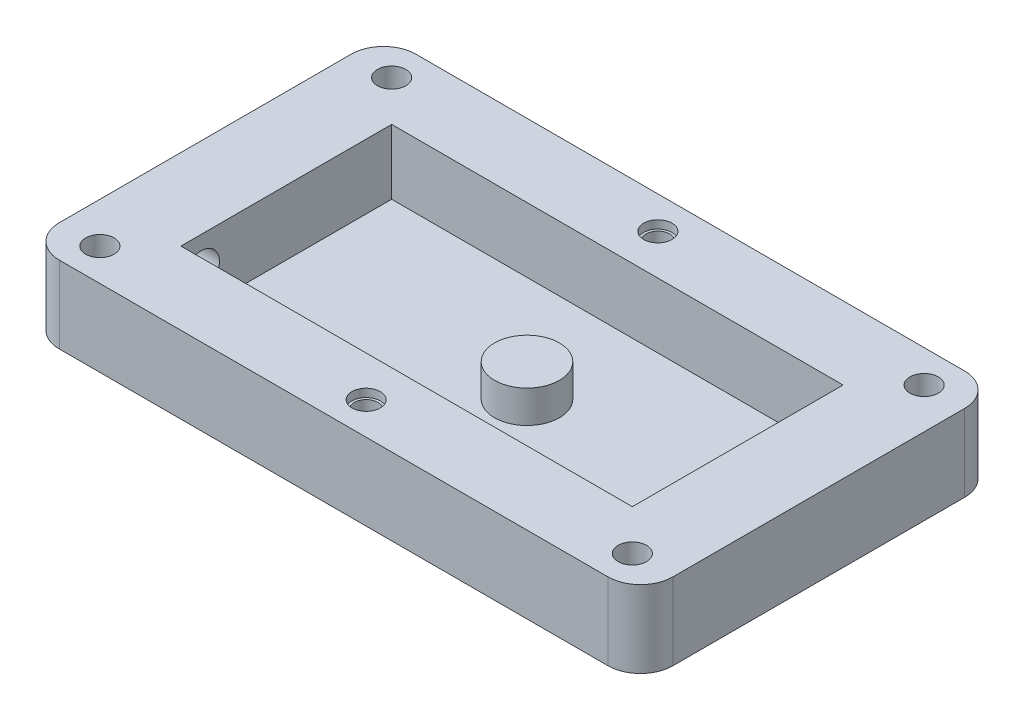
ISO-10303-21;
HEADER;
FILE_DESCRIPTION(('STEP AP214'),'2;1');
FILE_NAME('part.step','',(''),(''),'','','');
FILE_SCHEMA(('AUTOMOTIVE_DESIGN { 1 0 10303 214 1 1 1 1 }'));
ENDSEC;
DATA;
#1=APPLICATION_CONTEXT('core data for automotive mechanical design processes');
#2=APPLICATION_PROTOCOL_DEFINITION('international standard','automotive_design',2000,#1);
#3=PRODUCT_CONTEXT('',#1,'mechanical');
#4=PRODUCT('Part','Part','',(#3));
#5=PRODUCT_RELATED_PRODUCT_CATEGORY('part','',(#4));
#6=PRODUCT_DEFINITION_FORMATION('','',#4);
#7=PRODUCT_DEFINITION_CONTEXT('part definition',#1,'design');
#8=PRODUCT_DEFINITION('design','',#6,#7);
#9=PRODUCT_DEFINITION_SHAPE('','',#8);
#10=(LENGTH_UNIT() NAMED_UNIT(*) SI_UNIT(.MILLI.,.METRE.));
#11=(NAMED_UNIT(*) PLANE_ANGLE_UNIT() SI_UNIT($,.RADIAN.));
#12=(NAMED_UNIT(*) SI_UNIT($,.STERADIAN.) SOLID_ANGLE_UNIT());
#13=UNCERTAINTY_MEASURE_WITH_UNIT(LENGTH_MEASURE(1.E-05),#10,'distance_accuracy_value','');
#14=(GEOMETRIC_REPRESENTATION_CONTEXT(3) GLOBAL_UNCERTAINTY_ASSIGNED_CONTEXT((#13)) GLOBAL_UNIT_ASSIGNED_CONTEXT((#10,
#11,#12)) REPRESENTATION_CONTEXT('',''));
#15=CARTESIAN_POINT('',(0.,0.,0.));
#16=DIRECTION('',(0.,0.,1.));
#17=DIRECTION('',(1.,0.,0.));
#18=AXIS2_PLACEMENT_3D('',#15,#16,#17);
#19=CARTESIAN_POINT('',(0.,1.5,-22.));
#20=DIRECTION('',(0.,0.,-1.));
#21=DIRECTION('',(-1.,0.,0.));
#22=AXIS2_PLACEMENT_3D('',#19,#20,#21);
#23=PLANE('',#22);
#24=DIRECTION('',(1.,0.,0.));
#25=VECTOR('',#24,1.);
#26=CARTESIAN_POINT('',(0.,0.,-22.));
#27=LINE('',#26,#25);
#28=CARTESIAN_POINT('',(-39.25,0.,-22.));
#29=VERTEX_POINT('',#28);
#30=CARTESIAN_POINT('',(28.45,0.,-22.));
#31=VERTEX_POINT('',#30);
#32=EDGE_CURVE('E171',#29,#31,#27,.T.);
#33=ORIENTED_EDGE('',*,*,#32,.F.);
#34=DIRECTION('',(0.,-1.,0.));
#35=VECTOR('',#34,1.);
#36=CARTESIAN_POINT('',(-39.25,1.5,-22.));
#37=LINE('',#36,#35);
#38=CARTESIAN_POINT('',(-39.25,9.5,-22.));
#39=VERTEX_POINT('',#38);
#40=EDGE_CURVE('E44',#39,#29,#37,.T.);
#41=ORIENTED_EDGE('',*,*,#40,.F.);
#42=DIRECTION('',(1.,0.,0.));
#43=VECTOR('',#42,1.);
#44=CARTESIAN_POINT('',(0.,9.5,-22.));
#45=LINE('',#44,#43);
#46=CARTESIAN_POINT('',(28.45,9.5,-22.));
#47=VERTEX_POINT('',#46);
#48=EDGE_CURVE('E248',#39,#47,#45,.T.);
#49=ORIENTED_EDGE('',*,*,#48,.T.);
#50=DIRECTION('',(0.,-1.,0.));
#51=VECTOR('',#50,1.);
#52=CARTESIAN_POINT('',(28.45,1.5,-22.));
#53=LINE('',#52,#51);
#54=EDGE_CURVE('E195',#47,#31,#53,.T.);
#55=ORIENTED_EDGE('',*,*,#54,.T.);
#56=EDGE_LOOP('',(#33,#41,#49,#55));
#57=FACE_BOUND('',#56,.T.);
#58=ADVANCED_FACE('F35',(#57),#23,.T.);
#59=CARTESIAN_POINT('',(-39.25,1.5,-18.));
#60=DIRECTION('',(0.,-1.,0.));
#61=DIRECTION('',(0.,0.,-1.));
#62=AXIS2_PLACEMENT_3D('',#59,#60,#61);
#63=CYLINDRICAL_SURFACE('',#62,4.);
#64=CARTESIAN_POINT('',(-39.25,0.,-18.));
#65=DIRECTION('',(0.,1.,0.));
#66=DIRECTION('',(0.,0.,1.));
#67=AXIS2_PLACEMENT_3D('',#64,#65,#66);
#68=CIRCLE('',#67,4.);
#69=CARTESIAN_POINT('',(-43.25,0.,-18.));
#70=VERTEX_POINT('',#69);
#71=EDGE_CURVE('E174',#29,#70,#68,.T.);
#72=ORIENTED_EDGE('',*,*,#71,.T.);
#73=DIRECTION('',(0.,-1.,0.));
#74=VECTOR('',#73,1.);
#75=CARTESIAN_POINT('',(-43.25,1.5,-18.));
#76=LINE('',#75,#74);
#77=CARTESIAN_POINT('',(-43.25,9.5,-18.));
#78=VERTEX_POINT('',#77);
#79=EDGE_CURVE('E210',#78,#70,#76,.T.);
#80=ORIENTED_EDGE('',*,*,#79,.F.);
#81=CARTESIAN_POINT('',(-39.25,9.5,-18.));
#82=DIRECTION('',(0.,1.,0.));
#83=DIRECTION('',(0.,0.,1.));
#84=AXIS2_PLACEMENT_3D('',#81,#82,#83);
#85=CIRCLE('',#84,4.);
#86=EDGE_CURVE('E251',#39,#78,#85,.T.);
#87=ORIENTED_EDGE('',*,*,#86,.F.);
#88=ORIENTED_EDGE('',*,*,#40,.T.);
#89=EDGE_LOOP('',(#72,#80,#87,#88));
#90=FACE_BOUND('',#89,.T.);
#91=ADVANCED_FACE('F288',(#90),#63,.T.);
#92=CARTESIAN_POINT('',(-43.25,1.5,0.));
#93=DIRECTION('',(1.,0.,0.));
#94=DIRECTION('',(0.,0.,-1.));
#95=AXIS2_PLACEMENT_3D('',#92,#93,#94);
#96=PLANE('',#95);
#97=CARTESIAN_POINT('',(-43.25,5.5,10.5));
#98=DIRECTION('',(-1.,0.,0.));
#99=DIRECTION('',(0.,0.,1.));
#100=AXIS2_PLACEMENT_3D('',#97,#98,#99);
#101=CIRCLE('',#100,2.25);
#102=CARTESIAN_POINT('',(-43.25,5.5,12.75));
#103=VERTEX_POINT('',#102);
#104=EDGE_CURVE('E217',#103,#103,#101,.T.);
#105=ORIENTED_EDGE('',*,*,#104,.F.);
#106=EDGE_LOOP('',(#105));
#107=FACE_BOUND('',#106,.T.);
#108=DIRECTION('',(0.,0.,1.));
#109=VECTOR('',#108,1.);
#110=CARTESIAN_POINT('',(-43.25,0.,0.));
#111=LINE('',#110,#109);
#112=CARTESIAN_POINT('',(-43.25,0.,18.));
#113=VERTEX_POINT('',#112);
#114=EDGE_CURVE('E177',#70,#113,#111,.T.);
#115=ORIENTED_EDGE('',*,*,#114,.T.);
#116=DIRECTION('',(0.,-1.,0.));
#117=VECTOR('',#116,1.);
#118=CARTESIAN_POINT('',(-43.25,1.5,18.));
#119=LINE('',#118,#117);
#120=CARTESIAN_POINT('',(-43.25,9.5,18.));
#121=VERTEX_POINT('',#120);
#122=EDGE_CURVE('E207',#121,#113,#119,.T.);
#123=ORIENTED_EDGE('',*,*,#122,.F.);
#124=DIRECTION('',(0.,0.,1.));
#125=VECTOR('',#124,1.);
#126=CARTESIAN_POINT('',(-43.25,9.5,0.));
#127=LINE('',#126,#125);
#128=EDGE_CURVE('E254',#78,#121,#127,.T.);
#129=ORIENTED_EDGE('',*,*,#128,.F.);
#130=ORIENTED_EDGE('',*,*,#79,.T.);
#131=EDGE_LOOP('',(#115,#123,#129,#130));
#132=FACE_BOUND('',#131,.T.);
#133=ADVANCED_FACE('F294',(#107,#132),#96,.F.);
#134=CARTESIAN_POINT('',(-39.25,1.5,18.));
#135=DIRECTION('',(0.,-1.,0.));
#136=DIRECTION('',(0.,0.,-1.));
#137=AXIS2_PLACEMENT_3D('',#134,#135,#136);
#138=CYLINDRICAL_SURFACE('',#137,4.);
#139=CARTESIAN_POINT('',(-39.25,0.,18.));
#140=DIRECTION('',(0.,1.,0.));
#141=DIRECTION('',(0.,0.,1.));
#142=AXIS2_PLACEMENT_3D('',#139,#140,#141);
#143=CIRCLE('',#142,4.);
#144=CARTESIAN_POINT('',(-39.25,0.,22.));
#145=VERTEX_POINT('',#144);
#146=EDGE_CURVE('E180',#113,#145,#143,.T.);
#147=ORIENTED_EDGE('',*,*,#146,.T.);
#148=DIRECTION('',(0.,-1.,0.));
#149=VECTOR('',#148,1.);
#150=CARTESIAN_POINT('',(-39.25,1.5,22.));
#151=LINE('',#150,#149);
#152=CARTESIAN_POINT('',(-39.25,9.5,22.));
#153=VERTEX_POINT('',#152);
#154=EDGE_CURVE('E204',#153,#145,#151,.T.);
#155=ORIENTED_EDGE('',*,*,#154,.F.);
#156=CARTESIAN_POINT('',(-39.25,9.5,18.));
#157=DIRECTION('',(0.,1.,0.));
#158=DIRECTION('',(0.,0.,1.));
#159=AXIS2_PLACEMENT_3D('',#156,#157,#158);
#160=CIRCLE('',#159,4.);
#161=EDGE_CURVE('E257',#121,#153,#160,.T.);
#162=ORIENTED_EDGE('',*,*,#161,.F.);
#163=ORIENTED_EDGE('',*,*,#122,.T.);
#164=EDGE_LOOP('',(#147,#155,#162,#163));
#165=FACE_BOUND('',#164,.T.);
#166=ADVANCED_FACE('F405',(#165),#138,.T.);
#167=CARTESIAN_POINT('',(0.,1.5,22.));
#168=DIRECTION('',(0.,0.,-1.));
#169=DIRECTION('',(-1.,0.,0.));
#170=AXIS2_PLACEMENT_3D('',#167,#168,#169);
#171=PLANE('',#170);
#172=DIRECTION('',(1.,0.,0.));
#173=VECTOR('',#172,1.);
#174=CARTESIAN_POINT('',(0.,0.,22.));
#175=LINE('',#174,#173);
#176=CARTESIAN_POINT('',(28.45,0.,22.));
#177=VERTEX_POINT('',#176);
#178=EDGE_CURVE('E183',#145,#177,#175,.T.);
#179=ORIENTED_EDGE('',*,*,#178,.T.);
#180=DIRECTION('',(0.,-1.,0.));
#181=VECTOR('',#180,1.);
#182=CARTESIAN_POINT('',(28.45,1.5,22.));
#183=LINE('',#182,#181);
#184=CARTESIAN_POINT('',(28.45,9.5,22.));
#185=VERTEX_POINT('',#184);
#186=EDGE_CURVE('E201',#185,#177,#183,.T.);
#187=ORIENTED_EDGE('',*,*,#186,.F.);
#188=DIRECTION('',(1.,0.,0.));
#189=VECTOR('',#188,1.);
#190=CARTESIAN_POINT('',(0.,9.5,22.));
#191=LINE('',#190,#189);
#192=EDGE_CURVE('E260',#153,#185,#191,.T.);
#193=ORIENTED_EDGE('',*,*,#192,.F.);
#194=ORIENTED_EDGE('',*,*,#154,.T.);
#195=EDGE_LOOP('',(#179,#187,#193,#194));
#196=FACE_BOUND('',#195,.T.);
#197=ADVANCED_FACE('F407',(#196),#171,.F.);
#198=CARTESIAN_POINT('',(28.45,1.5,18.));
#199=DIRECTION('',(0.,-1.,0.));
#200=DIRECTION('',(0.,0.,-1.));
#201=AXIS2_PLACEMENT_3D('',#198,#199,#200);
#202=CYLINDRICAL_SURFACE('',#201,4.);
#203=CARTESIAN_POINT('',(28.45,0.,18.));
#204=DIRECTION('',(0.,1.,0.));
#205=DIRECTION('',(0.,0.,1.));
#206=AXIS2_PLACEMENT_3D('',#203,#204,#205);
#207=CIRCLE('',#206,4.);
#208=CARTESIAN_POINT('',(32.45,0.,17.9999999999999));
#209=VERTEX_POINT('',#208);
#210=EDGE_CURVE('E186',#177,#209,#207,.T.);
#211=ORIENTED_EDGE('',*,*,#210,.T.);
#212=DIRECTION('',(0.,-1.,0.));
#213=VECTOR('',#212,1.);
#214=CARTESIAN_POINT('',(32.45,1.5,17.9999999999999));
#215=LINE('',#214,#213);
#216=CARTESIAN_POINT('',(32.45,9.5,17.9999999999999));
#217=VERTEX_POINT('',#216);
#218=EDGE_CURVE('E199',#217,#209,#215,.T.);
#219=ORIENTED_EDGE('',*,*,#218,.F.);
#220=CARTESIAN_POINT('',(28.45,9.5,18.));
#221=DIRECTION('',(0.,1.,0.));
#222=DIRECTION('',(0.,0.,1.));
#223=AXIS2_PLACEMENT_3D('',#220,#221,#222);
#224=CIRCLE('',#223,4.);
#225=EDGE_CURVE('E263',#185,#217,#224,.T.);
#226=ORIENTED_EDGE('',*,*,#225,.F.);
#227=ORIENTED_EDGE('',*,*,#186,.T.);
#228=EDGE_LOOP('',(#211,#219,#226,#227));
#229=FACE_BOUND('',#228,.T.);
#230=ADVANCED_FACE('F410',(#229),#202,.T.);
#231=CARTESIAN_POINT('',(32.45,1.5,0.));
#232=DIRECTION('',(1.,0.,0.));
#233=DIRECTION('',(0.,0.,-1.));
#234=AXIS2_PLACEMENT_3D('',#231,#232,#233);
#235=PLANE('',#234);
#236=DIRECTION('',(0.,0.,1.));
#237=VECTOR('',#236,1.);
#238=CARTESIAN_POINT('',(32.45,0.,0.));
#239=LINE('',#238,#237);
#240=CARTESIAN_POINT('',(32.45,0.,-18.));
#241=VERTEX_POINT('',#240);
#242=EDGE_CURVE('E189',#241,#209,#239,.T.);
#243=ORIENTED_EDGE('',*,*,#242,.F.);
#244=DIRECTION('',(0.,-1.,0.));
#245=VECTOR('',#244,1.);
#246=CARTESIAN_POINT('',(32.45,1.5,-18.));
#247=LINE('',#246,#245);
#248=CARTESIAN_POINT('',(32.45,9.5,-18.));
#249=VERTEX_POINT('',#248);
#250=EDGE_CURVE('E197',#249,#241,#247,.T.);
#251=ORIENTED_EDGE('',*,*,#250,.F.);
#252=DIRECTION('',(0.,0.,1.));
#253=VECTOR('',#252,1.);
#254=CARTESIAN_POINT('',(32.45,9.5,0.));
#255=LINE('',#254,#253);
#256=EDGE_CURVE('E266',#249,#217,#255,.T.);
#257=ORIENTED_EDGE('',*,*,#256,.T.);
#258=ORIENTED_EDGE('',*,*,#218,.T.);
#259=EDGE_LOOP('',(#243,#251,#257,#258));
#260=FACE_BOUND('',#259,.T.);
#261=ADVANCED_FACE('F304',(#260),#235,.T.);
#262=CARTESIAN_POINT('',(-5.4,1.5,18.));
#263=DIRECTION('',(0.,-1.,0.));
#264=DIRECTION('',(0.,0.,-1.));
#265=AXIS2_PLACEMENT_3D('',#262,#263,#264);
#266=CYLINDRICAL_SURFACE('',#265,1.75000000000001);
#267=CARTESIAN_POINT('',(-5.4,8.5,18.));
#268=DIRECTION('',(0.,1.,0.));
#269=DIRECTION('',(0.,0.,1.));
#270=AXIS2_PLACEMENT_3D('',#267,#268,#269);
#271=CIRCLE('',#270,1.75000000000001);
#272=CARTESIAN_POINT('',(-5.4,8.5,19.75));
#273=VERTEX_POINT('',#272);
#274=EDGE_CURVE('E39',#273,#273,#271,.F.);
#275=ORIENTED_EDGE('',*,*,#274,.T.);
#276=EDGE_LOOP('',(#275));
#277=FACE_BOUND('',#276,.T.);
#278=CARTESIAN_POINT('',(-5.4,9.5,18.));
#279=DIRECTION('',(0.,1.,0.));
#280=DIRECTION('',(0.,0.,1.));
#281=AXIS2_PLACEMENT_3D('',#278,#279,#280);
#282=CIRCLE('',#281,1.75000000000001);
#283=CARTESIAN_POINT('',(-5.4,9.5,19.75));
#284=VERTEX_POINT('',#283);
#285=EDGE_CURVE('E245',#284,#284,#282,.F.);
#286=ORIENTED_EDGE('',*,*,#285,.F.);
#287=EDGE_LOOP('',(#286));
#288=FACE_BOUND('',#287,.T.);
#289=ADVANCED_FACE('F300',(#277,#288),#266,.F.);
#290=CARTESIAN_POINT('',(27.45,1.5,18.));
#291=DIRECTION('',(0.,-1.,0.));
#292=DIRECTION('',(0.,0.,-1.));
#293=AXIS2_PLACEMENT_3D('',#290,#291,#292);
#294=CYLINDRICAL_SURFACE('',#293,1.75);
#295=CARTESIAN_POINT('',(27.45,0.,18.));
#296=DIRECTION('',(0.,1.,0.));
#297=DIRECTION('',(0.,0.,1.));
#298=AXIS2_PLACEMENT_3D('',#295,#296,#297);
#299=CIRCLE('',#298,1.75);
#300=CARTESIAN_POINT('',(27.45,0.,19.75));
#301=VERTEX_POINT('',#300);
#302=EDGE_CURVE('E168',#301,#301,#299,.T.);
#303=ORIENTED_EDGE('',*,*,#302,.F.);
#304=EDGE_LOOP('',(#303));
#305=FACE_BOUND('',#304,.T.);
#306=CARTESIAN_POINT('',(27.45,9.5,18.));
#307=DIRECTION('',(0.,1.,0.));
#308=DIRECTION('',(0.,0.,1.));
#309=AXIS2_PLACEMENT_3D('',#306,#307,#308);
#310=CIRCLE('',#309,1.75);
#311=CARTESIAN_POINT('',(27.45,9.5,19.75));
#312=VERTEX_POINT('',#311);
#313=EDGE_CURVE('E242',#312,#312,#310,.T.);
#314=ORIENTED_EDGE('',*,*,#313,.T.);
#315=EDGE_LOOP('',(#314));
#316=FACE_BOUND('',#315,.T.);
#317=ADVANCED_FACE('F303',(#305,#316),#294,.F.);
#318=CARTESIAN_POINT('',(-5.4,1.5,-18.));
#319=DIRECTION('',(0.,-1.,0.));
#320=DIRECTION('',(0.,0.,-1.));
#321=AXIS2_PLACEMENT_3D('',#318,#319,#320);
#322=CYLINDRICAL_SURFACE('',#321,1.75);
#323=CARTESIAN_POINT('',(-5.4,8.5,-18.));
#324=DIRECTION('',(0.,1.,0.));
#325=DIRECTION('',(0.,0.,1.));
#326=AXIS2_PLACEMENT_3D('',#323,#324,#325);
#327=CIRCLE('',#326,1.75);
#328=CARTESIAN_POINT('',(-5.4,8.5,-16.25));
#329=VERTEX_POINT('',#328);
#330=EDGE_CURVE('E11',#329,#329,#327,.T.);
#331=ORIENTED_EDGE('',*,*,#330,.F.);
#332=EDGE_LOOP('',(#331));
#333=FACE_BOUND('',#332,.T.);
#334=CARTESIAN_POINT('',(-5.4,9.5,-18.));
#335=DIRECTION('',(0.,1.,0.));
#336=DIRECTION('',(0.,0.,1.));
#337=AXIS2_PLACEMENT_3D('',#334,#335,#336);
#338=CIRCLE('',#337,1.75);
#339=CARTESIAN_POINT('',(-5.4,9.5,-16.25));
#340=VERTEX_POINT('',#339);
#341=EDGE_CURVE('E144',#340,#340,#338,.T.);
#342=ORIENTED_EDGE('',*,*,#341,.T.);
#343=EDGE_LOOP('',(#342));
#344=FACE_BOUND('',#343,.T.);
#345=ADVANCED_FACE('F308',(#333,#344),#322,.F.);
#346=CARTESIAN_POINT('',(-38.25,1.5,-18.));
#347=DIRECTION('',(0.,-1.,0.));
#348=DIRECTION('',(0.,0.,-1.));
#349=AXIS2_PLACEMENT_3D('',#346,#347,#348);
#350=CYLINDRICAL_SURFACE('',#349,1.75);
#351=CARTESIAN_POINT('',(-38.25,0.,-18.));
#352=DIRECTION('',(0.,1.,0.));
#353=DIRECTION('',(0.,0.,1.));
#354=AXIS2_PLACEMENT_3D('',#351,#352,#353);
#355=CIRCLE('',#354,1.75);
#356=CARTESIAN_POINT('',(-38.25,0.,-16.25));
#357=VERTEX_POINT('',#356);
#358=EDGE_CURVE('E165',#357,#357,#355,.T.);
#359=ORIENTED_EDGE('',*,*,#358,.F.);
#360=EDGE_LOOP('',(#359));
#361=FACE_BOUND('',#360,.T.);
#362=CARTESIAN_POINT('',(-38.25,9.5,-18.));
#363=DIRECTION('',(0.,1.,0.));
#364=DIRECTION('',(0.,0.,1.));
#365=AXIS2_PLACEMENT_3D('',#362,#363,#364);
#366=CIRCLE('',#365,1.75);
#367=CARTESIAN_POINT('',(-38.25,9.5,-16.25));
#368=VERTEX_POINT('',#367);
#369=EDGE_CURVE('E235',#368,#368,#366,.T.);
#370=ORIENTED_EDGE('',*,*,#369,.T.);
#371=EDGE_LOOP('',(#370));
#372=FACE_BOUND('',#371,.T.);
#373=ADVANCED_FACE('F312',(#361,#372),#350,.F.);
#374=CARTESIAN_POINT('',(27.45,1.5,-18.));
#375=DIRECTION('',(0.,-1.,0.));
#376=DIRECTION('',(0.,0.,-1.));
#377=AXIS2_PLACEMENT_3D('',#374,#375,#376);
#378=CYLINDRICAL_SURFACE('',#377,1.75);
#379=CARTESIAN_POINT('',(27.45,0.,-18.));
#380=DIRECTION('',(0.,1.,0.));
#381=DIRECTION('',(0.,0.,1.));
#382=AXIS2_PLACEMENT_3D('',#379,#380,#381);
#383=CIRCLE('',#382,1.75);
#384=CARTESIAN_POINT('',(27.45,0.,-16.25));
#385=VERTEX_POINT('',#384);
#386=EDGE_CURVE('E162',#385,#385,#383,.F.);
#387=ORIENTED_EDGE('',*,*,#386,.T.);
#388=EDGE_LOOP('',(#387));
#389=FACE_BOUND('',#388,.T.);
#390=CARTESIAN_POINT('',(27.45,9.5,-18.));
#391=DIRECTION('',(0.,1.,0.));
#392=DIRECTION('',(0.,0.,1.));
#393=AXIS2_PLACEMENT_3D('',#390,#391,#392);
#394=CIRCLE('',#393,1.75);
#395=CARTESIAN_POINT('',(27.45,9.5,-16.25));
#396=VERTEX_POINT('',#395);
#397=EDGE_CURVE('E221',#396,#396,#394,.F.);
#398=ORIENTED_EDGE('',*,*,#397,.F.);
#399=EDGE_LOOP('',(#398));
#400=FACE_BOUND('',#399,.T.);
#401=ADVANCED_FACE('F315',(#389,#400),#378,.F.);
#402=CARTESIAN_POINT('',(-38.25,1.5,18.));
#403=DIRECTION('',(0.,-1.,0.));
#404=DIRECTION('',(0.,0.,-1.));
#405=AXIS2_PLACEMENT_3D('',#402,#403,#404);
#406=CYLINDRICAL_SURFACE('',#405,1.75);
#407=CARTESIAN_POINT('',(-38.25,0.,18.));
#408=DIRECTION('',(0.,1.,0.));
#409=DIRECTION('',(0.,0.,1.));
#410=AXIS2_PLACEMENT_3D('',#407,#408,#409);
#411=CIRCLE('',#410,1.75);
#412=CARTESIAN_POINT('',(-38.25,0.,19.75));
#413=VERTEX_POINT('',#412);
#414=EDGE_CURVE('E159',#413,#413,#411,.F.);
#415=ORIENTED_EDGE('',*,*,#414,.T.);
#416=EDGE_LOOP('',(#415));
#417=FACE_BOUND('',#416,.T.);
#418=CARTESIAN_POINT('',(-38.25,9.5,18.));
#419=DIRECTION('',(0.,1.,0.));
#420=DIRECTION('',(0.,0.,1.));
#421=AXIS2_PLACEMENT_3D('',#418,#419,#420);
#422=CIRCLE('',#421,1.75);
#423=CARTESIAN_POINT('',(-38.25,9.5,19.75));
#424=VERTEX_POINT('',#423);
#425=EDGE_CURVE('E216',#424,#424,#422,.F.);
#426=ORIENTED_EDGE('',*,*,#425,.F.);
#427=EDGE_LOOP('',(#426));
#428=FACE_BOUND('',#427,.T.);
#429=ADVANCED_FACE('F37',(#417,#428),#406,.F.);
#430=CARTESIAN_POINT('',(28.45,1.5,-18.));
#431=DIRECTION('',(0.,-1.,0.));
#432=DIRECTION('',(0.,0.,-1.));
#433=AXIS2_PLACEMENT_3D('',#430,#431,#432);
#434=CYLINDRICAL_SURFACE('',#433,4.);
#435=CARTESIAN_POINT('',(28.45,0.,-18.));
#436=DIRECTION('',(0.,1.,0.));
#437=DIRECTION('',(0.,0.,1.));
#438=AXIS2_PLACEMENT_3D('',#435,#436,#437);
#439=CIRCLE('',#438,4.);
#440=EDGE_CURVE('E192',#31,#241,#439,.F.);
#441=ORIENTED_EDGE('',*,*,#440,.F.);
#442=ORIENTED_EDGE('',*,*,#54,.F.);
#443=CARTESIAN_POINT('',(28.45,9.5,-18.));
#444=DIRECTION('',(0.,1.,0.));
#445=DIRECTION('',(0.,0.,1.));
#446=AXIS2_PLACEMENT_3D('',#443,#444,#445);
#447=CIRCLE('',#446,4.);
#448=EDGE_CURVE('E269',#47,#249,#447,.F.);
#449=ORIENTED_EDGE('',*,*,#448,.T.);
#450=ORIENTED_EDGE('',*,*,#250,.T.);
#451=EDGE_LOOP('',(#441,#442,#449,#450));
#452=FACE_BOUND('',#451,.T.);
#453=ADVANCED_FACE('F322',(#452),#434,.T.);
#454=CARTESIAN_POINT('',(0.,0.,0.));
#455=DIRECTION('',(0.,1.,0.));
#456=DIRECTION('',(0.,0.,1.));
#457=AXIS2_PLACEMENT_3D('',#454,#455,#456);
#458=PLANE('',#457);
#459=ORIENTED_EDGE('',*,*,#414,.F.);
#460=EDGE_LOOP('',(#459));
#461=FACE_BOUND('',#460,.T.);
#462=ORIENTED_EDGE('',*,*,#386,.F.);
#463=EDGE_LOOP('',(#462));
#464=FACE_BOUND('',#463,.T.);
#465=ORIENTED_EDGE('',*,*,#358,.T.);
#466=EDGE_LOOP('',(#465));
#467=FACE_BOUND('',#466,.T.);
#468=ORIENTED_EDGE('',*,*,#302,.T.);
#469=EDGE_LOOP('',(#468));
#470=FACE_BOUND('',#469,.T.);
#471=ORIENTED_EDGE('',*,*,#32,.T.);
#472=ORIENTED_EDGE('',*,*,#440,.T.);
#473=ORIENTED_EDGE('',*,*,#242,.T.);
#474=ORIENTED_EDGE('',*,*,#210,.F.);
#475=ORIENTED_EDGE('',*,*,#178,.F.);
#476=ORIENTED_EDGE('',*,*,#146,.F.);
#477=ORIENTED_EDGE('',*,*,#114,.F.);
#478=ORIENTED_EDGE('',*,*,#71,.F.);
#479=EDGE_LOOP('',(#471,#472,#473,#474,#475,#476,#477,#478));
#480=FACE_BOUND('',#479,.T.);
#481=CARTESIAN_POINT('',(-5.4,0.,-18.));
#482=DIRECTION('',(0.,1.,0.));
#483=DIRECTION('',(0.,0.,1.));
#484=AXIS2_PLACEMENT_3D('',#481,#482,#483);
#485=CIRCLE('',#484,1.45);
#486=CARTESIAN_POINT('',(-5.4,0.,-16.55));
#487=VERTEX_POINT('',#486);
#488=EDGE_CURVE('E224',#487,#487,#485,.F.);
#489=ORIENTED_EDGE('',*,*,#488,.F.);
#490=EDGE_LOOP('',(#489));
#491=FACE_BOUND('',#490,.T.);
#492=CARTESIAN_POINT('',(-5.4,0.,18.));
#493=DIRECTION('',(0.,1.,0.));
#494=DIRECTION('',(0.,0.,1.));
#495=AXIS2_PLACEMENT_3D('',#492,#493,#494);
#496=CIRCLE('',#495,1.45000000000001);
#497=CARTESIAN_POINT('',(-5.4,0.,19.45));
#498=VERTEX_POINT('',#497);
#499=EDGE_CURVE('E379',#498,#498,#496,.F.);
#500=ORIENTED_EDGE('',*,*,#499,.F.);
#501=EDGE_LOOP('',(#500));
#502=FACE_BOUND('',#501,.T.);
#503=ADVANCED_FACE('F416',(#461,#464,#467,#470,#480,#491,#502),#458,.F.);
#504=CARTESIAN_POINT('',(0.,9.5,-13.));
#505=DIRECTION('',(0.,0.,-1.));
#506=DIRECTION('',(-1.,0.,0.));
#507=AXIS2_PLACEMENT_3D('',#504,#505,#506);
#508=PLANE('',#507);
#509=DIRECTION('',(-1.,0.,0.));
#510=VECTOR('',#509,1.);
#511=CARTESIAN_POINT('',(0.,1.5,-13.));
#512=LINE('',#511,#510);
#513=CARTESIAN_POINT('',(22.45,1.5,-13.));
#514=VERTEX_POINT('',#513);
#515=CARTESIAN_POINT('',(-33.25,1.5,-13.));
#516=VERTEX_POINT('',#515);
#517=EDGE_CURVE('E147',#514,#516,#512,.T.);
#518=ORIENTED_EDGE('',*,*,#517,.F.);
#519=DIRECTION('',(0.,-1.,0.));
#520=VECTOR('',#519,1.);
#521=CARTESIAN_POINT('',(22.45,9.5,-13.));
#522=LINE('',#521,#520);
#523=CARTESIAN_POINT('',(22.45,9.5,-13.));
#524=VERTEX_POINT('',#523);
#525=EDGE_CURVE('E127',#524,#514,#522,.T.);
#526=ORIENTED_EDGE('',*,*,#525,.F.);
#527=DIRECTION('',(1.,0.,0.));
#528=VECTOR('',#527,1.);
#529=CARTESIAN_POINT('',(0.,9.5,-13.));
#530=LINE('',#529,#528);
#531=CARTESIAN_POINT('',(-33.25,9.5,-13.));
#532=VERTEX_POINT('',#531);
#533=EDGE_CURVE('E134',#532,#524,#530,.T.);
#534=ORIENTED_EDGE('',*,*,#533,.F.);
#535=DIRECTION('',(0.,-1.,0.));
#536=VECTOR('',#535,1.);
#537=CARTESIAN_POINT('',(-33.25,9.5,-13.));
#538=LINE('',#537,#536);
#539=EDGE_CURVE('E272',#532,#516,#538,.T.);
#540=ORIENTED_EDGE('',*,*,#539,.T.);
#541=EDGE_LOOP('',(#518,#526,#534,#540));
#542=FACE_BOUND('',#541,.T.);
#543=ADVANCED_FACE('F146',(#542),#508,.F.);
#544=CARTESIAN_POINT('',(22.45,9.5,0.));
#545=DIRECTION('',(1.,0.,0.));
#546=DIRECTION('',(0.,0.,-1.));
#547=AXIS2_PLACEMENT_3D('',#544,#545,#546);
#548=PLANE('',#547);
#549=DIRECTION('',(0.,0.,-1.));
#550=VECTOR('',#549,1.);
#551=CARTESIAN_POINT('',(22.45,1.5,0.));
#552=LINE('',#551,#550);
#553=CARTESIAN_POINT('',(22.45,1.5,13.));
#554=VERTEX_POINT('',#553);
#555=EDGE_CURVE('E51',#554,#514,#552,.T.);
#556=ORIENTED_EDGE('',*,*,#555,.F.);
#557=DIRECTION('',(0.,-1.,0.));
#558=VECTOR('',#557,1.);
#559=CARTESIAN_POINT('',(22.45,9.5,13.));
#560=LINE('',#559,#558);
#561=CARTESIAN_POINT('',(22.45,9.5,13.));
#562=VERTEX_POINT('',#561);
#563=EDGE_CURVE('E129',#562,#554,#560,.T.);
#564=ORIENTED_EDGE('',*,*,#563,.F.);
#565=DIRECTION('',(0.,0.,1.));
#566=VECTOR('',#565,1.);
#567=CARTESIAN_POINT('',(22.45,9.5,0.));
#568=LINE('',#567,#566);
#569=EDGE_CURVE('E123',#524,#562,#568,.T.);
#570=ORIENTED_EDGE('',*,*,#569,.F.);
#571=ORIENTED_EDGE('',*,*,#525,.T.);
#572=EDGE_LOOP('',(#556,#564,#570,#571));
#573=FACE_BOUND('',#572,.T.);
#574=ADVANCED_FACE('F125',(#573),#548,.F.);
#575=CARTESIAN_POINT('',(0.,9.5,13.));
#576=DIRECTION('',(0.,0.,-1.));
#577=DIRECTION('',(-1.,0.,0.));
#578=AXIS2_PLACEMENT_3D('',#575,#576,#577);
#579=PLANE('',#578);
#580=ORIENTED_EDGE('',*,*,#563,.T.);
#581=DIRECTION('',(-1.,0.,0.));
#582=VECTOR('',#581,1.);
#583=CARTESIAN_POINT('',(0.,1.5,13.));
#584=LINE('',#583,#582);
#585=CARTESIAN_POINT('',(-33.25,1.5,13.));
#586=VERTEX_POINT('',#585);
#587=EDGE_CURVE('E56',#554,#586,#584,.T.);
#588=ORIENTED_EDGE('',*,*,#587,.T.);
#589=DIRECTION('',(0.,-1.,0.));
#590=VECTOR('',#589,1.);
#591=CARTESIAN_POINT('',(-33.25,9.5,13.));
#592=LINE('',#591,#590);
#593=CARTESIAN_POINT('',(-33.25,9.5,13.));
#594=VERTEX_POINT('',#593);
#595=EDGE_CURVE('E152',#594,#586,#592,.T.);
#596=ORIENTED_EDGE('',*,*,#595,.F.);
#597=DIRECTION('',(1.,0.,0.));
#598=VECTOR('',#597,1.);
#599=CARTESIAN_POINT('',(0.,9.5,13.));
#600=LINE('',#599,#598);
#601=EDGE_CURVE('E133',#594,#562,#600,.T.);
#602=ORIENTED_EDGE('',*,*,#601,.T.);
#603=EDGE_LOOP('',(#580,#588,#596,#602));
#604=FACE_BOUND('',#603,.T.);
#605=ADVANCED_FACE('F277',(#604),#579,.T.);
#606=CARTESIAN_POINT('',(-33.25,9.5,0.));
#607=DIRECTION('',(1.,0.,0.));
#608=DIRECTION('',(0.,0.,-1.));
#609=AXIS2_PLACEMENT_3D('',#606,#607,#608);
#610=PLANE('',#609);
#611=CARTESIAN_POINT('',(-33.25,5.5,10.5));
#612=DIRECTION('',(1.,0.,0.));
#613=DIRECTION('',(0.,0.,-1.));
#614=AXIS2_PLACEMENT_3D('',#611,#612,#613);
#615=CIRCLE('',#614,2.25);
#616=CARTESIAN_POINT('',(-33.25,5.5,8.24999999999999));
#617=VERTEX_POINT('',#616);
#618=EDGE_CURVE('E214',#617,#617,#615,.T.);
#619=ORIENTED_EDGE('',*,*,#618,.F.);
#620=EDGE_LOOP('',(#619));
#621=FACE_BOUND('',#620,.T.);
#622=ORIENTED_EDGE('',*,*,#595,.T.);
#623=DIRECTION('',(0.,0.,-1.));
#624=VECTOR('',#623,1.);
#625=CARTESIAN_POINT('',(-33.25,1.5,0.));
#626=LINE('',#625,#624);
#627=EDGE_CURVE('E148',#586,#516,#626,.T.);
#628=ORIENTED_EDGE('',*,*,#627,.T.);
#629=ORIENTED_EDGE('',*,*,#539,.F.);
#630=DIRECTION('',(0.,0.,1.));
#631=VECTOR('',#630,1.);
#632=CARTESIAN_POINT('',(-33.25,9.5,0.));
#633=LINE('',#632,#631);
#634=EDGE_CURVE('E141',#532,#594,#633,.T.);
#635=ORIENTED_EDGE('',*,*,#634,.T.);
#636=EDGE_LOOP('',(#622,#628,#629,#635));
#637=FACE_BOUND('',#636,.T.);
#638=ADVANCED_FACE('F275',(#621,#637),#610,.T.);
#639=CARTESIAN_POINT('',(0.,9.5,0.));
#640=DIRECTION('',(0.,1.,0.));
#641=DIRECTION('',(0.,0.,1.));
#642=AXIS2_PLACEMENT_3D('',#639,#640,#641);
#643=PLANE('',#642);
#644=ORIENTED_EDGE('',*,*,#425,.T.);
#645=EDGE_LOOP('',(#644));
#646=FACE_BOUND('',#645,.T.);
#647=ORIENTED_EDGE('',*,*,#397,.T.);
#648=EDGE_LOOP('',(#647));
#649=FACE_BOUND('',#648,.T.);
#650=ORIENTED_EDGE('',*,*,#369,.F.);
#651=EDGE_LOOP('',(#650));
#652=FACE_BOUND('',#651,.T.);
#653=ORIENTED_EDGE('',*,*,#341,.F.);
#654=EDGE_LOOP('',(#653));
#655=FACE_BOUND('',#654,.T.);
#656=ORIENTED_EDGE('',*,*,#533,.T.);
#657=ORIENTED_EDGE('',*,*,#569,.T.);
#658=ORIENTED_EDGE('',*,*,#601,.F.);
#659=ORIENTED_EDGE('',*,*,#634,.F.);
#660=EDGE_LOOP('',(#656,#657,#658,#659));
#661=FACE_BOUND('',#660,.T.);
#662=ORIENTED_EDGE('',*,*,#313,.F.);
#663=EDGE_LOOP('',(#662));
#664=FACE_BOUND('',#663,.T.);
#665=ORIENTED_EDGE('',*,*,#285,.T.);
#666=EDGE_LOOP('',(#665));
#667=FACE_BOUND('',#666,.T.);
#668=ORIENTED_EDGE('',*,*,#48,.F.);
#669=ORIENTED_EDGE('',*,*,#86,.T.);
#670=ORIENTED_EDGE('',*,*,#128,.T.);
#671=ORIENTED_EDGE('',*,*,#161,.T.);
#672=ORIENTED_EDGE('',*,*,#192,.T.);
#673=ORIENTED_EDGE('',*,*,#225,.T.);
#674=ORIENTED_EDGE('',*,*,#256,.F.);
#675=ORIENTED_EDGE('',*,*,#448,.F.);
#676=EDGE_LOOP('',(#668,#669,#670,#671,#672,#673,#674,#675));
#677=FACE_BOUND('',#676,.T.);
#678=ADVANCED_FACE('F138',(#646,#649,#652,#655,#661,#664,#667,#677),#643,.T.);
#679=CARTESIAN_POINT('',(0.,1.5,0.));
#680=DIRECTION('',(0.,1.,0.));
#681=DIRECTION('',(0.,0.,1.));
#682=AXIS2_PLACEMENT_3D('',#679,#680,#681);
#683=PLANE('',#682);
#684=CARTESIAN_POINT('',(-3.55,1.5,0.));
#685=DIRECTION('',(0.,1.,0.));
#686=DIRECTION('',(0.,0.,1.));
#687=AXIS2_PLACEMENT_3D('',#684,#685,#686);
#688=CIRCLE('',#687,4.);
#689=CARTESIAN_POINT('',(-3.55,1.5,4.));
#690=VERTEX_POINT('',#689);
#691=EDGE_CURVE('E376',#690,#690,#688,.T.);
#692=ORIENTED_EDGE('',*,*,#691,.F.);
#693=EDGE_LOOP('',(#692));
#694=FACE_BOUND('',#693,.T.);
#695=ORIENTED_EDGE('',*,*,#555,.T.);
#696=ORIENTED_EDGE('',*,*,#517,.T.);
#697=ORIENTED_EDGE('',*,*,#627,.F.);
#698=ORIENTED_EDGE('',*,*,#587,.F.);
#699=EDGE_LOOP('',(#695,#696,#697,#698));
#700=FACE_BOUND('',#699,.T.);
#701=ADVANCED_FACE('F330',(#694,#700),#683,.T.);
#702=CARTESIAN_POINT('',(-31.75,5.5,10.5));
#703=DIRECTION('',(-1.,0.,0.));
#704=DIRECTION('',(0.,0.,1.));
#705=AXIS2_PLACEMENT_3D('',#702,#703,#704);
#706=CYLINDRICAL_SURFACE('',#705,2.25);
#707=ORIENTED_EDGE('',*,*,#618,.T.);
#708=EDGE_LOOP('',(#707));
#709=FACE_BOUND('',#708,.T.);
#710=ORIENTED_EDGE('',*,*,#104,.T.);
#711=EDGE_LOOP('',(#710));
#712=FACE_BOUND('',#711,.T.);
#713=ADVANCED_FACE('F341',(#709,#712),#706,.F.);
#714=CARTESIAN_POINT('',(-5.4,8.5,-18.));
#715=DIRECTION('',(0.,1.,0.));
#716=DIRECTION('',(0.,0.,1.));
#717=AXIS2_PLACEMENT_3D('',#714,#715,#716);
#718=PLANE('',#717);
#719=CARTESIAN_POINT('',(-5.4,8.5,-18.));
#720=DIRECTION('',(0.,1.,0.));
#721=DIRECTION('',(0.,0.,1.));
#722=AXIS2_PLACEMENT_3D('',#719,#720,#721);
#723=CIRCLE('',#722,1.45);
#724=CARTESIAN_POINT('',(-5.4,8.5,-16.55));
#725=VERTEX_POINT('',#724);
#726=EDGE_CURVE('E229',#725,#725,#723,.T.);
#727=ORIENTED_EDGE('',*,*,#726,.F.);
#728=EDGE_LOOP('',(#727));
#729=FACE_BOUND('',#728,.T.);
#730=ORIENTED_EDGE('',*,*,#330,.T.);
#731=EDGE_LOOP('',(#730));
#732=FACE_BOUND('',#731,.T.);
#733=ADVANCED_FACE('F347',(#729,#732),#718,.T.);
#734=CARTESIAN_POINT('',(-5.4,-5.79827560572971,-18.));
#735=DIRECTION('',(0.,1.,0.));
#736=DIRECTION('',(0.,0.,1.));
#737=AXIS2_PLACEMENT_3D('',#734,#735,#736);
#738=CYLINDRICAL_SURFACE('',#737,1.45);
#739=CARTESIAN_POINT('',(-5.4,0.,-16.55));
#740=CARTESIAN_POINT('',(-5.4,0.0885416666666658,-16.55));
#741=CARTESIAN_POINT('',(-5.4,0.177083333333333,-16.55));
#742=CARTESIAN_POINT('',(-5.4,0.354166666666666,-16.55));
#743=CARTESIAN_POINT('',(-5.4,0.442708333333333,-16.55));
#744=CARTESIAN_POINT('',(-5.4,0.619791666666666,-16.55));
#745=CARTESIAN_POINT('',(-5.4,0.708333333333332,-16.55));
#746=CARTESIAN_POINT('',(-5.4,0.885416666666666,-16.55));
#747=CARTESIAN_POINT('',(-5.4,0.973958333333332,-16.55));
#748=CARTESIAN_POINT('',(-5.4,1.15104166666667,-16.55));
#749=CARTESIAN_POINT('',(-5.4,1.23958333333333,-16.55));
#750=CARTESIAN_POINT('',(-5.4,1.41666666666667,-16.55));
#751=CARTESIAN_POINT('',(-5.4,1.50520833333333,-16.55));
#752=CARTESIAN_POINT('',(-5.4,1.68229166666667,-16.55));
#753=CARTESIAN_POINT('',(-5.4,1.77083333333333,-16.55));
#754=CARTESIAN_POINT('',(-5.4,1.94791666666667,-16.55));
#755=CARTESIAN_POINT('',(-5.4,2.03645833333333,-16.55));
#756=CARTESIAN_POINT('',(-5.4,2.21354166666667,-16.55));
#757=CARTESIAN_POINT('',(-5.4,2.30208333333333,-16.55));
#758=CARTESIAN_POINT('',(-5.4,2.47916666666667,-16.55));
#759=CARTESIAN_POINT('',(-5.4,2.56770833333333,-16.55));
#760=CARTESIAN_POINT('',(-5.4,2.74479166666667,-16.55));
#761=CARTESIAN_POINT('',(-5.4,2.83333333333333,-16.55));
#762=CARTESIAN_POINT('',(-5.4,3.01041666666667,-16.55));
#763=CARTESIAN_POINT('',(-5.4,3.09895833333333,-16.55));
#764=CARTESIAN_POINT('',(-5.4,3.27604166666666,-16.55));
#765=CARTESIAN_POINT('',(-5.4,3.36458333333333,-16.55));
#766=CARTESIAN_POINT('',(-5.4,3.54166666666667,-16.55));
#767=CARTESIAN_POINT('',(-5.4,3.63020833333333,-16.55));
#768=CARTESIAN_POINT('',(-5.4,3.80729166666667,-16.55));
#769=CARTESIAN_POINT('',(-5.4,3.89583333333333,-16.55));
#770=CARTESIAN_POINT('',(-5.4,4.07291666666667,-16.55));
#771=CARTESIAN_POINT('',(-5.4,4.16145833333333,-16.55));
#772=CARTESIAN_POINT('',(-5.4,4.33854166666667,-16.55));
#773=CARTESIAN_POINT('',(-5.4,4.42708333333333,-16.55));
#774=CARTESIAN_POINT('',(-5.4,4.60416666666667,-16.55));
#775=CARTESIAN_POINT('',(-5.4,4.69270833333333,-16.55));
#776=CARTESIAN_POINT('',(-5.4,4.86979166666667,-16.55));
#777=CARTESIAN_POINT('',(-5.4,4.95833333333333,-16.55));
#778=CARTESIAN_POINT('',(-5.4,5.13541666666667,-16.55));
#779=CARTESIAN_POINT('',(-5.4,5.22395833333333,-16.55));
#780=CARTESIAN_POINT('',(-5.4,5.40104166666667,-16.55));
#781=CARTESIAN_POINT('',(-5.4,5.48958333333333,-16.55));
#782=CARTESIAN_POINT('',(-5.4,5.66666666666666,-16.55));
#783=CARTESIAN_POINT('',(-5.4,5.75520833333333,-16.55));
#784=CARTESIAN_POINT('',(-5.4,5.93229166666666,-16.55));
#785=CARTESIAN_POINT('',(-5.4,6.02083333333333,-16.55));
#786=CARTESIAN_POINT('',(-5.4,6.19791666666667,-16.55));
#787=CARTESIAN_POINT('',(-5.4,6.28645833333333,-16.55));
#788=CARTESIAN_POINT('',(-5.4,6.46354166666667,-16.55));
#789=CARTESIAN_POINT('',(-5.4,6.55208333333333,-16.55));
#790=CARTESIAN_POINT('',(-5.4,6.72916666666667,-16.55));
#791=CARTESIAN_POINT('',(-5.4,6.81770833333333,-16.55));
#792=CARTESIAN_POINT('',(-5.4,6.99479166666667,-16.55));
#793=CARTESIAN_POINT('',(-5.4,7.08333333333333,-16.55));
#794=CARTESIAN_POINT('',(-5.4,7.26041666666667,-16.55));
#795=CARTESIAN_POINT('',(-5.4,7.34895833333333,-16.55));
#796=CARTESIAN_POINT('',(-5.4,7.52604166666667,-16.55));
#797=CARTESIAN_POINT('',(-5.4,7.61458333333333,-16.55));
#798=CARTESIAN_POINT('',(-5.4,7.79166666666667,-16.55));
#799=CARTESIAN_POINT('',(-5.4,7.88020833333333,-16.55));
#800=CARTESIAN_POINT('',(-5.4,8.05729166666667,-16.55));
#801=CARTESIAN_POINT('',(-5.4,8.14583333333333,-16.55));
#802=CARTESIAN_POINT('',(-5.4,8.32291666666667,-16.55));
#803=CARTESIAN_POINT('',(-5.4,8.41145833333333,-16.55));
#804=CARTESIAN_POINT('',(-5.4,8.5,-16.55));
#805=B_SPLINE_CURVE_WITH_KNOTS('',3,(#739,#740,#741,#742,#743,#744,#745,#746,#747,#748,#749,
#750,#751,#752,#753,#754,#755,#756,#757,#758,#759,#760,#761,#762,#763,#764,#765,#766,#767,#768,
#769,#770,#771,#772,#773,#774,#775,#776,#777,#778,#779,#780,#781,#782,#783,#784,#785,#786,#787,
#788,#789,#790,#791,#792,#793,#794,#795,#796,#797,#798,#799,#800,#801,#802,#803,#804),
.UNSPECIFIED.,.F.,.F.,(4,2,2,2,2,2,2,2,2,2,2,2,2,2,2,2,2,2,2,2,2,2,2,2,2,2,2,2,2,2,2,2,4),(0.,
0.265625,0.53125,0.796875,1.0625,1.328125,1.59375,1.859375,2.125,2.390625,2.65625,2.921875,
3.1875,3.453125,3.71875,3.984375,4.25,4.515625,4.78125,5.046875,5.3125,5.578125,5.84375,
6.109375,6.375,6.640625,6.90625,7.171875,7.4375,7.703125,7.96875,8.234375,8.5),.UNSPECIFIED.);
#806=EDGE_CURVE('BSEAM350',#487,#725,#805,.T.);
#807=ORIENTED_EDGE('',*,*,#488,.T.);
#808=ORIENTED_EDGE('',*,*,#726,.T.);
#809=ORIENTED_EDGE('',*,*,#806,.T.);
#810=ORIENTED_EDGE('',*,*,#806,.F.);
#811=EDGE_LOOP('',(#807,#809,#808,#810));
#812=FACE_BOUND('',#811,.T.);
#813=ADVANCED_FACE('F350',(#812),#738,.F.);
#814=CARTESIAN_POINT('',(-5.4,8.5,18.));
#815=DIRECTION('',(0.,1.,0.));
#816=DIRECTION('',(0.,0.,1.));
#817=AXIS2_PLACEMENT_3D('',#814,#815,#816);
#818=PLANE('',#817);
#819=CARTESIAN_POINT('',(-5.4,8.5,18.));
#820=DIRECTION('',(0.,1.,0.));
#821=DIRECTION('',(0.,0.,1.));
#822=AXIS2_PLACEMENT_3D('',#819,#820,#821);
#823=CIRCLE('',#822,1.45000000000001);
#824=CARTESIAN_POINT('',(-5.4,8.5,19.45));
#825=VERTEX_POINT('',#824);
#826=EDGE_CURVE('E375',#825,#825,#823,.T.);
#827=ORIENTED_EDGE('',*,*,#826,.F.);
#828=EDGE_LOOP('',(#827));
#829=FACE_BOUND('',#828,.T.);
#830=ORIENTED_EDGE('',*,*,#274,.F.);
#831=EDGE_LOOP('',(#830));
#832=FACE_BOUND('',#831,.T.);
#833=ADVANCED_FACE('F354',(#829,#832),#818,.T.);
#834=CARTESIAN_POINT('',(-5.4,-5.79827560572971,18.));
#835=DIRECTION('',(0.,1.,0.));
#836=DIRECTION('',(0.,0.,1.));
#837=AXIS2_PLACEMENT_3D('',#834,#835,#836);
#838=CYLINDRICAL_SURFACE('',#837,1.45000000000001);
#839=CARTESIAN_POINT('',(-5.4,0.,19.45));
#840=CARTESIAN_POINT('',(-5.4,0.0885416666666658,19.45));
#841=CARTESIAN_POINT('',(-5.4,0.177083333333333,19.45));
#842=CARTESIAN_POINT('',(-5.4,0.354166666666666,19.45));
#843=CARTESIAN_POINT('',(-5.4,0.442708333333333,19.45));
#844=CARTESIAN_POINT('',(-5.4,0.619791666666666,19.45));
#845=CARTESIAN_POINT('',(-5.4,0.708333333333332,19.45));
#846=CARTESIAN_POINT('',(-5.4,0.885416666666666,19.45));
#847=CARTESIAN_POINT('',(-5.4,0.973958333333332,19.45));
#848=CARTESIAN_POINT('',(-5.4,1.15104166666667,19.45));
#849=CARTESIAN_POINT('',(-5.4,1.23958333333333,19.45));
#850=CARTESIAN_POINT('',(-5.4,1.41666666666667,19.45));
#851=CARTESIAN_POINT('',(-5.4,1.50520833333333,19.45));
#852=CARTESIAN_POINT('',(-5.4,1.68229166666667,19.45));
#853=CARTESIAN_POINT('',(-5.4,1.77083333333333,19.45));
#854=CARTESIAN_POINT('',(-5.4,1.94791666666667,19.45));
#855=CARTESIAN_POINT('',(-5.4,2.03645833333333,19.45));
#856=CARTESIAN_POINT('',(-5.4,2.21354166666667,19.45));
#857=CARTESIAN_POINT('',(-5.4,2.30208333333333,19.45));
#858=CARTESIAN_POINT('',(-5.4,2.47916666666667,19.45));
#859=CARTESIAN_POINT('',(-5.4,2.56770833333333,19.45));
#860=CARTESIAN_POINT('',(-5.4,2.74479166666667,19.45));
#861=CARTESIAN_POINT('',(-5.4,2.83333333333333,19.45));
#862=CARTESIAN_POINT('',(-5.4,3.01041666666667,19.45));
#863=CARTESIAN_POINT('',(-5.4,3.09895833333333,19.45));
#864=CARTESIAN_POINT('',(-5.4,3.27604166666666,19.45));
#865=CARTESIAN_POINT('',(-5.4,3.36458333333333,19.45));
#866=CARTESIAN_POINT('',(-5.4,3.54166666666667,19.45));
#867=CARTESIAN_POINT('',(-5.4,3.63020833333333,19.45));
#868=CARTESIAN_POINT('',(-5.4,3.80729166666667,19.45));
#869=CARTESIAN_POINT('',(-5.4,3.89583333333333,19.45));
#870=CARTESIAN_POINT('',(-5.4,4.07291666666667,19.45));
#871=CARTESIAN_POINT('',(-5.4,4.16145833333333,19.45));
#872=CARTESIAN_POINT('',(-5.4,4.33854166666667,19.45));
#873=CARTESIAN_POINT('',(-5.4,4.42708333333333,19.45));
#874=CARTESIAN_POINT('',(-5.4,4.60416666666667,19.45));
#875=CARTESIAN_POINT('',(-5.4,4.69270833333333,19.45));
#876=CARTESIAN_POINT('',(-5.4,4.86979166666667,19.45));
#877=CARTESIAN_POINT('',(-5.4,4.95833333333333,19.45));
#878=CARTESIAN_POINT('',(-5.4,5.13541666666667,19.45));
#879=CARTESIAN_POINT('',(-5.4,5.22395833333333,19.45));
#880=CARTESIAN_POINT('',(-5.4,5.40104166666667,19.45));
#881=CARTESIAN_POINT('',(-5.4,5.48958333333333,19.45));
#882=CARTESIAN_POINT('',(-5.4,5.66666666666666,19.45));
#883=CARTESIAN_POINT('',(-5.4,5.75520833333333,19.45));
#884=CARTESIAN_POINT('',(-5.4,5.93229166666666,19.45));
#885=CARTESIAN_POINT('',(-5.4,6.02083333333333,19.45));
#886=CARTESIAN_POINT('',(-5.4,6.19791666666667,19.45));
#887=CARTESIAN_POINT('',(-5.4,6.28645833333333,19.45));
#888=CARTESIAN_POINT('',(-5.4,6.46354166666667,19.45));
#889=CARTESIAN_POINT('',(-5.4,6.55208333333333,19.45));
#890=CARTESIAN_POINT('',(-5.4,6.72916666666667,19.45));
#891=CARTESIAN_POINT('',(-5.4,6.81770833333333,19.45));
#892=CARTESIAN_POINT('',(-5.4,6.99479166666667,19.45));
#893=CARTESIAN_POINT('',(-5.4,7.08333333333333,19.45));
#894=CARTESIAN_POINT('',(-5.4,7.26041666666667,19.45));
#895=CARTESIAN_POINT('',(-5.4,7.34895833333333,19.45));
#896=CARTESIAN_POINT('',(-5.4,7.52604166666667,19.45));
#897=CARTESIAN_POINT('',(-5.4,7.61458333333333,19.45));
#898=CARTESIAN_POINT('',(-5.4,7.79166666666667,19.45));
#899=CARTESIAN_POINT('',(-5.4,7.88020833333333,19.45));
#900=CARTESIAN_POINT('',(-5.4,8.05729166666667,19.45));
#901=CARTESIAN_POINT('',(-5.4,8.14583333333333,19.45));
#902=CARTESIAN_POINT('',(-5.4,8.32291666666667,19.45));
#903=CARTESIAN_POINT('',(-5.4,8.41145833333333,19.45));
#904=CARTESIAN_POINT('',(-5.4,8.5,19.45));
#905=B_SPLINE_CURVE_WITH_KNOTS('',3,(#839,#840,#841,#842,#843,#844,#845,#846,#847,#848,#849,
#850,#851,#852,#853,#854,#855,#856,#857,#858,#859,#860,#861,#862,#863,#864,#865,#866,#867,#868,
#869,#870,#871,#872,#873,#874,#875,#876,#877,#878,#879,#880,#881,#882,#883,#884,#885,#886,#887,
#888,#889,#890,#891,#892,#893,#894,#895,#896,#897,#898,#899,#900,#901,#902,#903,#904),
.UNSPECIFIED.,.F.,.F.,(4,2,2,2,2,2,2,2,2,2,2,2,2,2,2,2,2,2,2,2,2,2,2,2,2,2,2,2,2,2,2,2,4),(0.,
0.265625,0.53125,0.796875,1.0625,1.328125,1.59375,1.859375,2.125,2.390625,2.65625,2.921875,
3.1875,3.453125,3.71875,3.984375,4.25,4.515625,4.78125,5.046875,5.3125,5.578125,5.84375,
6.109375,6.375,6.640625,6.90625,7.171875,7.4375,7.703125,7.96875,8.234375,8.5),.UNSPECIFIED.);
#906=EDGE_CURVE('BSEAM358',#498,#825,#905,.T.);
#907=ORIENTED_EDGE('',*,*,#499,.T.);
#908=ORIENTED_EDGE('',*,*,#826,.T.);
#909=ORIENTED_EDGE('',*,*,#906,.T.);
#910=ORIENTED_EDGE('',*,*,#906,.F.);
#911=EDGE_LOOP('',(#907,#909,#908,#910));
#912=FACE_BOUND('',#911,.T.);
#913=ADVANCED_FACE('F358',(#912),#838,.F.);
#914=CARTESIAN_POINT('',(-3.55,5.5,0.));
#915=DIRECTION('',(0.,-1.,0.));
#916=DIRECTION('',(0.,0.,-1.));
#917=AXIS2_PLACEMENT_3D('',#914,#915,#916);
#918=CYLINDRICAL_SURFACE('',#917,4.);
#919=CARTESIAN_POINT('',(-3.55,5.5,0.));
#920=DIRECTION('',(0.,1.,0.));
#921=DIRECTION('',(0.,0.,1.));
#922=AXIS2_PLACEMENT_3D('',#919,#920,#921);
#923=CIRCLE('',#922,4.);
#924=CARTESIAN_POINT('',(-3.55,5.5,4.));
#925=VERTEX_POINT('',#924);
#926=EDGE_CURVE('E374',#925,#925,#923,.T.);
#927=ORIENTED_EDGE('',*,*,#926,.F.);
#928=EDGE_LOOP('',(#927));
#929=FACE_BOUND('',#928,.T.);
#930=ORIENTED_EDGE('',*,*,#691,.T.);
#931=EDGE_LOOP('',(#930));
#932=FACE_BOUND('',#931,.T.);
#933=ADVANCED_FACE('F362',(#929,#932),#918,.T.);
#934=CARTESIAN_POINT('',(-3.55,5.5,0.));
#935=DIRECTION('',(0.,1.,0.));
#936=DIRECTION('',(0.,0.,1.));
#937=AXIS2_PLACEMENT_3D('',#934,#935,#936);
#938=PLANE('',#937);
#939=ORIENTED_EDGE('',*,*,#926,.T.);
#940=EDGE_LOOP('',(#939));
#941=FACE_BOUND('',#940,.T.);
#942=ADVANCED_FACE('F366',(#941),#938,.T.);
#943=CLOSED_SHELL('',(#58,#91,#133,#166,#197,#230,#261,#289,#317,#345,#373,#401,#429,#453,#503,
#543,#574,#605,#638,#678,#701,#713,#733,#813,#833,#913,#933,#942));
#944=MANIFOLD_SOLID_BREP('B2',#943);
#945=ADVANCED_BREP_SHAPE_REPRESENTATION('',(#18,#944),#14);
#946=SHAPE_DEFINITION_REPRESENTATION(#9,#945);
ENDSEC;
END-ISO-10303-21;
